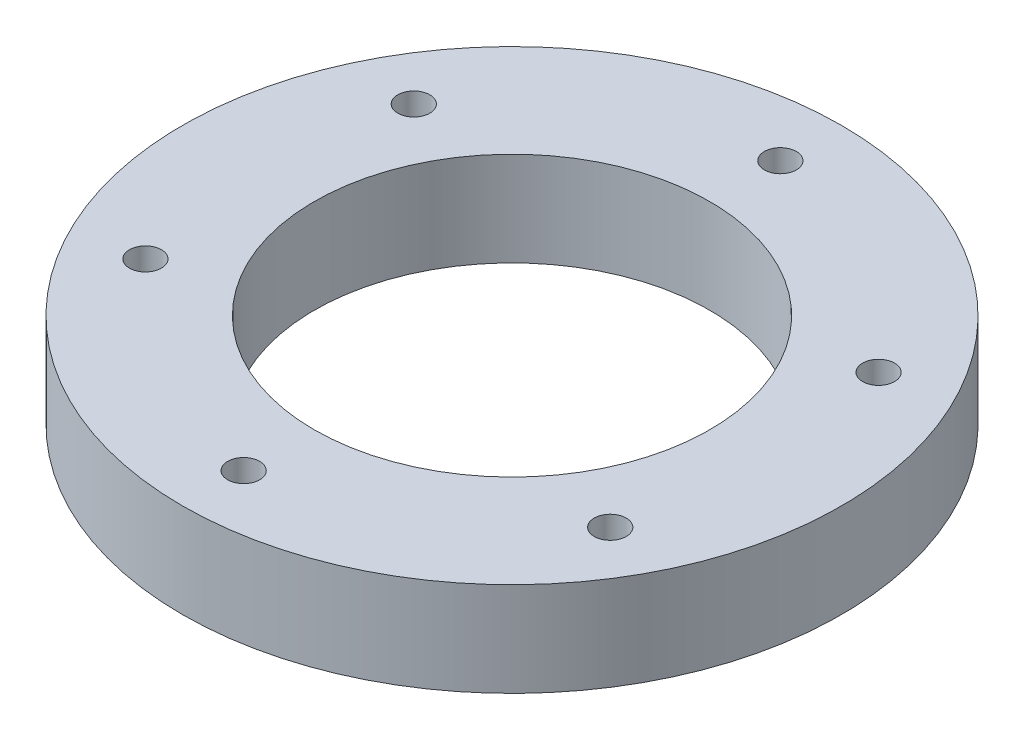
ISO-10303-21;
HEADER;
FILE_DESCRIPTION(('STEP AP214'),'2;1');
FILE_NAME('part.step','',(''),(''),'','','');
FILE_SCHEMA(('AUTOMOTIVE_DESIGN { 1 0 10303 214 1 1 1 1 }'));
ENDSEC;
DATA;
#1=APPLICATION_CONTEXT('core data for automotive mechanical design processes');
#2=APPLICATION_PROTOCOL_DEFINITION('international standard','automotive_design',2000,#1);
#3=PRODUCT_CONTEXT('',#1,'mechanical');
#4=PRODUCT('Part','Part','',(#3));
#5=PRODUCT_RELATED_PRODUCT_CATEGORY('part','',(#4));
#6=PRODUCT_DEFINITION_FORMATION('','',#4);
#7=PRODUCT_DEFINITION_CONTEXT('part definition',#1,'design');
#8=PRODUCT_DEFINITION('design','',#6,#7);
#9=PRODUCT_DEFINITION_SHAPE('','',#8);
#10=(LENGTH_UNIT() NAMED_UNIT(*) SI_UNIT(.MILLI.,.METRE.));
#11=(NAMED_UNIT(*) PLANE_ANGLE_UNIT() SI_UNIT($,.RADIAN.));
#12=(NAMED_UNIT(*) SI_UNIT($,.STERADIAN.) SOLID_ANGLE_UNIT());
#13=UNCERTAINTY_MEASURE_WITH_UNIT(LENGTH_MEASURE(1.E-05),#10,'distance_accuracy_value','');
#14=(GEOMETRIC_REPRESENTATION_CONTEXT(3) GLOBAL_UNCERTAINTY_ASSIGNED_CONTEXT((#13)) GLOBAL_UNIT_ASSIGNED_CONTEXT((#10,
#11,#12)) REPRESENTATION_CONTEXT('',''));
#15=CARTESIAN_POINT('',(0.,0.,0.));
#16=DIRECTION('',(0.,0.,1.));
#17=DIRECTION('',(1.,0.,0.));
#18=AXIS2_PLACEMENT_3D('',#15,#16,#17);
#19=CARTESIAN_POINT('',(0.,10.,0.));
#20=DIRECTION('',(0.,1.,0.));
#21=DIRECTION('',(0.,0.,1.));
#22=AXIS2_PLACEMENT_3D('',#19,#20,#21);
#23=PLANE('',#22);
#24=CARTESIAN_POINT('',(0.,10.,-28.5));
#25=DIRECTION('',(0.,1.,0.));
#26=DIRECTION('',(0.,0.,1.));
#27=AXIS2_PLACEMENT_3D('',#24,#25,#26);
#28=CIRCLE('',#27,1.7);
#29=CARTESIAN_POINT('',(0.,10.,-26.8));
#30=VERTEX_POINT('',#29);
#31=EDGE_CURVE('E75',#30,#30,#28,.T.);
#32=ORIENTED_EDGE('',*,*,#31,.F.);
#33=EDGE_LOOP('',(#32));
#34=FACE_BOUND('',#33,.T.);
#35=CARTESIAN_POINT('',(-24.6817240078559,10.,-14.2499999999989));
#36=DIRECTION('',(0.,1.,0.));
#37=DIRECTION('',(0.,0.,1.));
#38=AXIS2_PLACEMENT_3D('',#35,#36,#37);
#39=CIRCLE('',#38,1.70000000000122);
#40=CARTESIAN_POINT('',(-24.6817240078559,10.,-12.5499999999977));
#41=VERTEX_POINT('',#40);
#42=EDGE_CURVE('E76',#41,#41,#39,.T.);
#43=ORIENTED_EDGE('',*,*,#42,.F.);
#44=EDGE_LOOP('',(#43));
#45=FACE_BOUND('',#44,.T.);
#46=CARTESIAN_POINT('',(-24.6817240078547,10.,14.2500000000011));
#47=DIRECTION('',(0.,1.,0.));
#48=DIRECTION('',(0.,0.,1.));
#49=AXIS2_PLACEMENT_3D('',#46,#47,#48);
#50=CIRCLE('',#49,1.7000000000023);
#51=CARTESIAN_POINT('',(-24.6817240078547,10.,15.9500000000034));
#52=VERTEX_POINT('',#51);
#53=EDGE_CURVE('E50',#52,#52,#50,.T.);
#54=ORIENTED_EDGE('',*,*,#53,.F.);
#55=EDGE_LOOP('',(#54));
#56=FACE_BOUND('',#55,.T.);
#57=CARTESIAN_POINT('',(2.41958542616683E-12,10.,28.5));
#58=DIRECTION('',(0.,1.,0.));
#59=DIRECTION('',(0.,0.,1.));
#60=AXIS2_PLACEMENT_3D('',#57,#58,#59);
#61=CIRCLE('',#60,1.7000000000025);
#62=CARTESIAN_POINT('',(2.41958542616683E-12,10.,30.2000000000025));
#63=VERTEX_POINT('',#62);
#64=EDGE_CURVE('E57',#63,#63,#61,.T.);
#65=ORIENTED_EDGE('',*,*,#64,.F.);
#66=EDGE_LOOP('',(#65));
#67=FACE_BOUND('',#66,.T.);
#68=CARTESIAN_POINT('',(24.6817240078583,10.,14.2499999999989));
#69=DIRECTION('',(0.,1.,0.));
#70=DIRECTION('',(0.,0.,1.));
#71=AXIS2_PLACEMENT_3D('',#68,#69,#70);
#72=CIRCLE('',#71,1.70000000000156);
#73=CARTESIAN_POINT('',(24.6817240078583,10.,15.9500000000005));
#74=VERTEX_POINT('',#73);
#75=EDGE_CURVE('E63',#74,#74,#72,.T.);
#76=ORIENTED_EDGE('',*,*,#75,.F.);
#77=EDGE_LOOP('',(#76));
#78=FACE_BOUND('',#77,.T.);
#79=CARTESIAN_POINT('',(24.6817240078571,10.,-14.2500000000011));
#80=DIRECTION('',(0.,1.,0.));
#81=DIRECTION('',(0.,0.,1.));
#82=AXIS2_PLACEMENT_3D('',#79,#80,#81);
#83=CIRCLE('',#82,1.70000000000034);
#84=CARTESIAN_POINT('',(24.6817240078571,10.,-12.5500000000007));
#85=VERTEX_POINT('',#84);
#86=EDGE_CURVE('E69',#85,#85,#83,.T.);
#87=ORIENTED_EDGE('',*,*,#86,.F.);
#88=EDGE_LOOP('',(#87));
#89=FACE_BOUND('',#88,.T.);
#90=CARTESIAN_POINT('',(0.,10.,0.));
#91=DIRECTION('',(0.,1.,0.));
#92=DIRECTION('',(0.,0.,1.));
#93=AXIS2_PLACEMENT_3D('',#90,#91,#92);
#94=CIRCLE('',#93,35.);
#95=CARTESIAN_POINT('',(0.,10.,35.));
#96=VERTEX_POINT('',#95);
#97=EDGE_CURVE('E10',#96,#96,#94,.T.);
#98=ORIENTED_EDGE('',*,*,#97,.T.);
#99=EDGE_LOOP('',(#98));
#100=FACE_BOUND('',#99,.T.);
#101=CARTESIAN_POINT('',(0.,10.,0.));
#102=DIRECTION('',(0.,1.,0.));
#103=DIRECTION('',(0.,0.,1.));
#104=AXIS2_PLACEMENT_3D('',#101,#102,#103);
#105=CIRCLE('',#104,21.);
#106=CARTESIAN_POINT('',(0.,10.,21.));
#107=VERTEX_POINT('',#106);
#108=EDGE_CURVE('E42',#107,#107,#105,.T.);
#109=ORIENTED_EDGE('',*,*,#108,.F.);
#110=EDGE_LOOP('',(#109));
#111=FACE_BOUND('',#110,.T.);
#112=ADVANCED_FACE('F31',(#34,#45,#56,#67,#78,#89,#100,#111),#23,.T.);
#113=CARTESIAN_POINT('',(0.,0.,0.));
#114=DIRECTION('',(0.,1.,0.));
#115=DIRECTION('',(0.,0.,1.));
#116=AXIS2_PLACEMENT_3D('',#113,#114,#115);
#117=PLANE('',#116);
#118=CARTESIAN_POINT('',(0.,0.,-28.5));
#119=DIRECTION('',(0.,1.,0.));
#120=DIRECTION('',(0.,0.,1.));
#121=AXIS2_PLACEMENT_3D('',#118,#119,#120);
#122=CIRCLE('',#121,1.7);
#123=CARTESIAN_POINT('',(0.,0.,-26.8));
#124=VERTEX_POINT('',#123);
#125=EDGE_CURVE('E47',#124,#124,#122,.T.);
#126=ORIENTED_EDGE('',*,*,#125,.T.);
#127=EDGE_LOOP('',(#126));
#128=FACE_BOUND('',#127,.T.);
#129=CARTESIAN_POINT('',(-24.6817240078559,0.,-14.2499999999989));
#130=DIRECTION('',(0.,1.,0.));
#131=DIRECTION('',(0.,0.,1.));
#132=AXIS2_PLACEMENT_3D('',#129,#130,#131);
#133=CIRCLE('',#132,1.70000000000122);
#134=CARTESIAN_POINT('',(-24.6817240078559,0.,-12.5499999999977));
#135=VERTEX_POINT('',#134);
#136=EDGE_CURVE('E54',#135,#135,#133,.T.);
#137=ORIENTED_EDGE('',*,*,#136,.T.);
#138=EDGE_LOOP('',(#137));
#139=FACE_BOUND('',#138,.T.);
#140=CARTESIAN_POINT('',(-24.6817240078547,0.,14.2500000000011));
#141=DIRECTION('',(0.,1.,0.));
#142=DIRECTION('',(0.,0.,1.));
#143=AXIS2_PLACEMENT_3D('',#140,#141,#142);
#144=CIRCLE('',#143,1.7000000000023);
#145=CARTESIAN_POINT('',(-24.6817240078547,0.,15.9500000000034));
#146=VERTEX_POINT('',#145);
#147=EDGE_CURVE('E53',#146,#146,#144,.T.);
#148=ORIENTED_EDGE('',*,*,#147,.T.);
#149=EDGE_LOOP('',(#148));
#150=FACE_BOUND('',#149,.T.);
#151=CARTESIAN_POINT('',(2.41958542616683E-12,0.,28.5));
#152=DIRECTION('',(0.,1.,0.));
#153=DIRECTION('',(0.,0.,1.));
#154=AXIS2_PLACEMENT_3D('',#151,#152,#153);
#155=CIRCLE('',#154,1.7000000000025);
#156=CARTESIAN_POINT('',(2.41958542616683E-12,0.,30.2000000000025));
#157=VERTEX_POINT('',#156);
#158=EDGE_CURVE('E60',#157,#157,#155,.T.);
#159=ORIENTED_EDGE('',*,*,#158,.T.);
#160=EDGE_LOOP('',(#159));
#161=FACE_BOUND('',#160,.T.);
#162=CARTESIAN_POINT('',(24.6817240078583,0.,14.2499999999989));
#163=DIRECTION('',(0.,1.,0.));
#164=DIRECTION('',(0.,0.,1.));
#165=AXIS2_PLACEMENT_3D('',#162,#163,#164);
#166=CIRCLE('',#165,1.70000000000156);
#167=CARTESIAN_POINT('',(24.6817240078583,0.,15.9500000000005));
#168=VERTEX_POINT('',#167);
#169=EDGE_CURVE('E66',#168,#168,#166,.T.);
#170=ORIENTED_EDGE('',*,*,#169,.T.);
#171=EDGE_LOOP('',(#170));
#172=FACE_BOUND('',#171,.T.);
#173=CARTESIAN_POINT('',(24.6817240078571,0.,-14.2500000000011));
#174=DIRECTION('',(0.,1.,0.));
#175=DIRECTION('',(0.,0.,1.));
#176=AXIS2_PLACEMENT_3D('',#173,#174,#175);
#177=CIRCLE('',#176,1.70000000000034);
#178=CARTESIAN_POINT('',(24.6817240078571,0.,-12.5500000000007));
#179=VERTEX_POINT('',#178);
#180=EDGE_CURVE('E72',#179,#179,#177,.T.);
#181=ORIENTED_EDGE('',*,*,#180,.T.);
#182=EDGE_LOOP('',(#181));
#183=FACE_BOUND('',#182,.T.);
#184=CARTESIAN_POINT('',(0.,0.,0.));
#185=DIRECTION('',(0.,1.,0.));
#186=DIRECTION('',(0.,0.,1.));
#187=AXIS2_PLACEMENT_3D('',#184,#185,#186);
#188=CIRCLE('',#187,35.);
#189=CARTESIAN_POINT('',(0.,0.,35.));
#190=VERTEX_POINT('',#189);
#191=EDGE_CURVE('E35',#190,#190,#188,.T.);
#192=ORIENTED_EDGE('',*,*,#191,.F.);
#193=EDGE_LOOP('',(#192));
#194=FACE_BOUND('',#193,.T.);
#195=CARTESIAN_POINT('',(0.,0.,0.));
#196=DIRECTION('',(0.,1.,0.));
#197=DIRECTION('',(0.,0.,1.));
#198=AXIS2_PLACEMENT_3D('',#195,#196,#197);
#199=CIRCLE('',#198,21.);
#200=CARTESIAN_POINT('',(0.,0.,21.));
#201=VERTEX_POINT('',#200);
#202=EDGE_CURVE('E44',#201,#201,#199,.T.);
#203=ORIENTED_EDGE('',*,*,#202,.T.);
#204=EDGE_LOOP('',(#203));
#205=FACE_BOUND('',#204,.T.);
#206=ADVANCED_FACE('F86',(#128,#139,#150,#161,#172,#183,#194,#205),#117,.F.);
#207=CARTESIAN_POINT('',(0.,10.,0.));
#208=DIRECTION('',(0.,-1.,0.));
#209=DIRECTION('',(0.,0.,-1.));
#210=AXIS2_PLACEMENT_3D('',#207,#208,#209);
#211=CYLINDRICAL_SURFACE('',#210,35.);
#212=ORIENTED_EDGE('',*,*,#97,.F.);
#213=EDGE_LOOP('',(#212));
#214=FACE_BOUND('',#213,.T.);
#215=ORIENTED_EDGE('',*,*,#191,.T.);
#216=EDGE_LOOP('',(#215));
#217=FACE_BOUND('',#216,.T.);
#218=ADVANCED_FACE('F33',(#214,#217),#211,.T.);
#219=CARTESIAN_POINT('',(0.,10.,0.));
#220=DIRECTION('',(0.,-1.,0.));
#221=DIRECTION('',(0.,0.,-1.));
#222=AXIS2_PLACEMENT_3D('',#219,#220,#221);
#223=CYLINDRICAL_SURFACE('',#222,21.);
#224=ORIENTED_EDGE('',*,*,#108,.T.);
#225=EDGE_LOOP('',(#224));
#226=FACE_BOUND('',#225,.T.);
#227=ORIENTED_EDGE('',*,*,#202,.F.);
#228=EDGE_LOOP('',(#227));
#229=FACE_BOUND('',#228,.T.);
#230=ADVANCED_FACE('F111',(#226,#229),#223,.F.);
#231=CARTESIAN_POINT('',(24.6817240078571,0.,-14.2500000000011));
#232=DIRECTION('',(0.,1.,0.));
#233=DIRECTION('',(0.,0.,1.));
#234=AXIS2_PLACEMENT_3D('',#231,#232,#233);
#235=CYLINDRICAL_SURFACE('',#234,1.70000000000034);
#236=ORIENTED_EDGE('',*,*,#180,.F.);
#237=EDGE_LOOP('',(#236));
#238=FACE_BOUND('',#237,.T.);
#239=ORIENTED_EDGE('',*,*,#86,.T.);
#240=EDGE_LOOP('',(#239));
#241=FACE_BOUND('',#240,.T.);
#242=ADVANCED_FACE('F114',(#238,#241),#235,.F.);
#243=CARTESIAN_POINT('',(24.6817240078583,0.,14.2499999999989));
#244=DIRECTION('',(0.,1.,0.));
#245=DIRECTION('',(0.,0.,1.));
#246=AXIS2_PLACEMENT_3D('',#243,#244,#245);
#247=CYLINDRICAL_SURFACE('',#246,1.70000000000156);
#248=ORIENTED_EDGE('',*,*,#169,.F.);
#249=EDGE_LOOP('',(#248));
#250=FACE_BOUND('',#249,.T.);
#251=ORIENTED_EDGE('',*,*,#75,.T.);
#252=EDGE_LOOP('',(#251));
#253=FACE_BOUND('',#252,.T.);
#254=ADVANCED_FACE('F131',(#250,#253),#247,.F.);
#255=CARTESIAN_POINT('',(2.41958542616683E-12,0.,28.5));
#256=DIRECTION('',(0.,1.,0.));
#257=DIRECTION('',(0.,0.,1.));
#258=AXIS2_PLACEMENT_3D('',#255,#256,#257);
#259=CYLINDRICAL_SURFACE('',#258,1.7000000000025);
#260=ORIENTED_EDGE('',*,*,#158,.F.);
#261=EDGE_LOOP('',(#260));
#262=FACE_BOUND('',#261,.T.);
#263=ORIENTED_EDGE('',*,*,#64,.T.);
#264=EDGE_LOOP('',(#263));
#265=FACE_BOUND('',#264,.T.);
#266=ADVANCED_FACE('F127',(#262,#265),#259,.F.);
#267=CARTESIAN_POINT('',(-24.6817240078547,0.,14.2500000000011));
#268=DIRECTION('',(0.,1.,0.));
#269=DIRECTION('',(0.,0.,1.));
#270=AXIS2_PLACEMENT_3D('',#267,#268,#269);
#271=CYLINDRICAL_SURFACE('',#270,1.7000000000023);
#272=ORIENTED_EDGE('',*,*,#147,.F.);
#273=EDGE_LOOP('',(#272));
#274=FACE_BOUND('',#273,.T.);
#275=ORIENTED_EDGE('',*,*,#53,.T.);
#276=EDGE_LOOP('',(#275));
#277=FACE_BOUND('',#276,.T.);
#278=ADVANCED_FACE('F124',(#274,#277),#271,.F.);
#279=CARTESIAN_POINT('',(-24.6817240078559,0.,-14.2499999999989));
#280=DIRECTION('',(0.,1.,0.));
#281=DIRECTION('',(0.,0.,1.));
#282=AXIS2_PLACEMENT_3D('',#279,#280,#281);
#283=CYLINDRICAL_SURFACE('',#282,1.70000000000122);
#284=ORIENTED_EDGE('',*,*,#136,.F.);
#285=EDGE_LOOP('',(#284));
#286=FACE_BOUND('',#285,.T.);
#287=ORIENTED_EDGE('',*,*,#42,.T.);
#288=EDGE_LOOP('',(#287));
#289=FACE_BOUND('',#288,.T.);
#290=ADVANCED_FACE('F92',(#286,#289),#283,.F.);
#291=CARTESIAN_POINT('',(0.,0.,-28.5));
#292=DIRECTION('',(0.,1.,0.));
#293=DIRECTION('',(0.,0.,1.));
#294=AXIS2_PLACEMENT_3D('',#291,#292,#293);
#295=CYLINDRICAL_SURFACE('',#294,1.7);
#296=ORIENTED_EDGE('',*,*,#125,.F.);
#297=EDGE_LOOP('',(#296));
#298=FACE_BOUND('',#297,.T.);
#299=ORIENTED_EDGE('',*,*,#31,.T.);
#300=EDGE_LOOP('',(#299));
#301=FACE_BOUND('',#300,.T.);
#302=ADVANCED_FACE('F89',(#298,#301),#295,.F.);
#303=CLOSED_SHELL('',(#112,#206,#218,#230,#242,#254,#266,#278,#290,#302));
#304=MANIFOLD_SOLID_BREP('B2',#303);
#305=ADVANCED_BREP_SHAPE_REPRESENTATION('',(#18,#304),#14);
#306=SHAPE_DEFINITION_REPRESENTATION(#9,#305);
ENDSEC;
END-ISO-10303-21;
